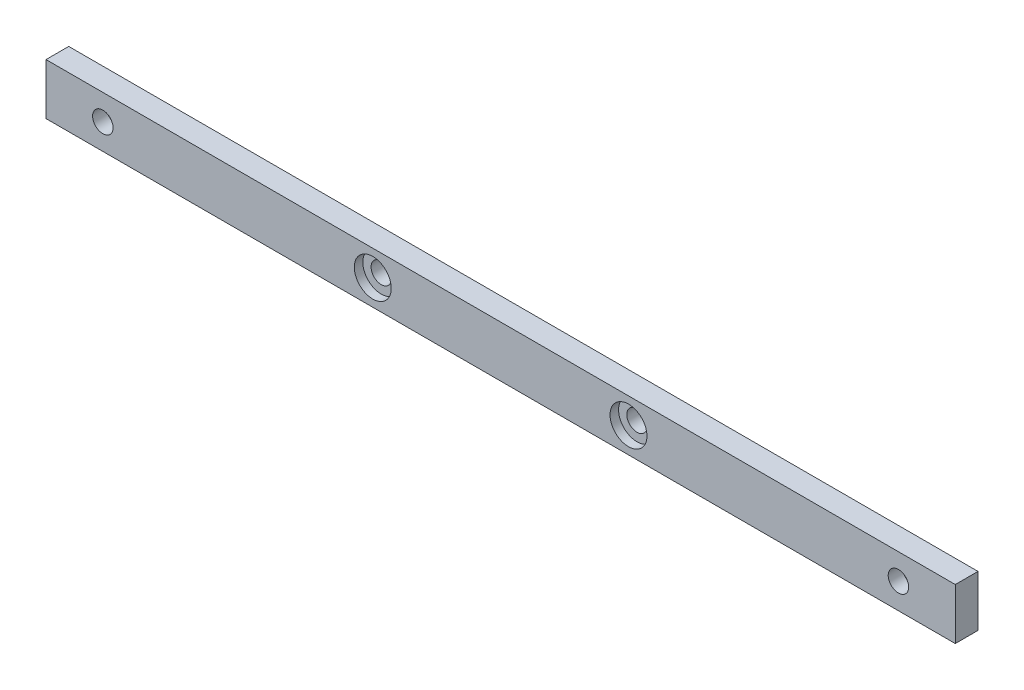
ISO-10303-21;
HEADER;
FILE_DESCRIPTION(('STEP AP214'),'2;1');
FILE_NAME('part.step','',(''),(''),'','','');
FILE_SCHEMA(('AUTOMOTIVE_DESIGN { 1 0 10303 214 1 1 1 1 }'));
ENDSEC;
DATA;
#1=APPLICATION_CONTEXT('core data for automotive mechanical design processes');
#2=APPLICATION_PROTOCOL_DEFINITION('international standard','automotive_design',2000,#1);
#3=PRODUCT_CONTEXT('',#1,'mechanical');
#4=PRODUCT('Part','Part','',(#3));
#5=PRODUCT_RELATED_PRODUCT_CATEGORY('part','',(#4));
#6=PRODUCT_DEFINITION_FORMATION('','',#4);
#7=PRODUCT_DEFINITION_CONTEXT('part definition',#1,'design');
#8=PRODUCT_DEFINITION('design','',#6,#7);
#9=PRODUCT_DEFINITION_SHAPE('','',#8);
#10=(LENGTH_UNIT() NAMED_UNIT(*) SI_UNIT(.MILLI.,.METRE.));
#11=(NAMED_UNIT(*) PLANE_ANGLE_UNIT() SI_UNIT($,.RADIAN.));
#12=(NAMED_UNIT(*) SI_UNIT($,.STERADIAN.) SOLID_ANGLE_UNIT());
#13=UNCERTAINTY_MEASURE_WITH_UNIT(LENGTH_MEASURE(1.E-05),#10,'distance_accuracy_value','');
#14=(GEOMETRIC_REPRESENTATION_CONTEXT(3) GLOBAL_UNCERTAINTY_ASSIGNED_CONTEXT((#13)) GLOBAL_UNIT_ASSIGNED_CONTEXT((#10,
#11,#12)) REPRESENTATION_CONTEXT('',''));
#15=CARTESIAN_POINT('',(0.,0.,0.));
#16=DIRECTION('',(0.,0.,1.));
#17=DIRECTION('',(1.,0.,0.));
#18=AXIS2_PLACEMENT_3D('',#15,#16,#17);
#19=CARTESIAN_POINT('',(52.5,14.5,-0.00100000000000013));
#20=DIRECTION('',(0.,0.,1.));
#21=DIRECTION('',(1.,0.,0.));
#22=AXIS2_PLACEMENT_3D('',#19,#20,#21);
#23=CYLINDRICAL_SURFACE('',#22,1.8);
#24=CARTESIAN_POINT('',(52.5,14.5,0.));
#25=DIRECTION('',(0.,0.,-1.));
#26=DIRECTION('',(-1.,0.,0.));
#27=AXIS2_PLACEMENT_3D('',#24,#25,#26);
#28=CIRCLE('',#27,1.8);
#29=CARTESIAN_POINT('',(50.7,14.5,0.));
#30=VERTEX_POINT('',#29);
#31=EDGE_CURVE('E120',#30,#30,#28,.F.);
#32=ORIENTED_EDGE('',*,*,#31,.F.);
#33=EDGE_LOOP('',(#32));
#34=FACE_BOUND('',#33,.T.);
#35=CARTESIAN_POINT('',(52.5,14.5,2.5));
#36=DIRECTION('',(0.,0.,1.));
#37=DIRECTION('',(1.,0.,0.));
#38=AXIS2_PLACEMENT_3D('',#35,#36,#37);
#39=CIRCLE('',#38,1.8);
#40=CARTESIAN_POINT('',(54.3,14.5,2.5));
#41=VERTEX_POINT('',#40);
#42=EDGE_CURVE('E39',#41,#41,#39,.F.);
#43=ORIENTED_EDGE('',*,*,#42,.F.);
#44=EDGE_LOOP('',(#43));
#45=FACE_BOUND('',#44,.T.);
#46=ADVANCED_FACE('F35',(#34,#45),#23,.F.);
#47=CARTESIAN_POINT('',(7.5,14.5,-0.00100000000000013));
#48=DIRECTION('',(0.,0.,1.));
#49=DIRECTION('',(1.,0.,0.));
#50=AXIS2_PLACEMENT_3D('',#47,#48,#49);
#51=CYLINDRICAL_SURFACE('',#50,1.8);
#52=CARTESIAN_POINT('',(7.5,14.5,0.));
#53=DIRECTION('',(0.,0.,-1.));
#54=DIRECTION('',(-1.,0.,0.));
#55=AXIS2_PLACEMENT_3D('',#52,#53,#54);
#56=CIRCLE('',#55,1.8);
#57=CARTESIAN_POINT('',(5.7,14.5,0.));
#58=VERTEX_POINT('',#57);
#59=EDGE_CURVE('E135',#58,#58,#56,.F.);
#60=ORIENTED_EDGE('',*,*,#59,.F.);
#61=EDGE_LOOP('',(#60));
#62=FACE_BOUND('',#61,.T.);
#63=CARTESIAN_POINT('',(7.5,14.5,2.5));
#64=DIRECTION('',(0.,0.,1.));
#65=DIRECTION('',(1.,0.,0.));
#66=AXIS2_PLACEMENT_3D('',#63,#64,#65);
#67=CIRCLE('',#66,1.8);
#68=CARTESIAN_POINT('',(9.3,14.5,2.5));
#69=VERTEX_POINT('',#68);
#70=EDGE_CURVE('E114',#69,#69,#67,.F.);
#71=ORIENTED_EDGE('',*,*,#70,.F.);
#72=EDGE_LOOP('',(#71));
#73=FACE_BOUND('',#72,.T.);
#74=ADVANCED_FACE('F178',(#62,#73),#51,.F.);
#75=CARTESIAN_POINT('',(-40.,14.5,-5.09116882454315));
#76=DIRECTION('',(0.,0.,1.));
#77=DIRECTION('',(1.,0.,0.));
#78=AXIS2_PLACEMENT_3D('',#75,#76,#77);
#79=CYLINDRICAL_SURFACE('',#78,1.8);
#80=CARTESIAN_POINT('',(-40.,14.5,4.));
#81=DIRECTION('',(0.,0.,1.));
#82=DIRECTION('',(1.,0.,0.));
#83=AXIS2_PLACEMENT_3D('',#80,#81,#82);
#84=CIRCLE('',#83,1.8);
#85=CARTESIAN_POINT('',(-38.2,14.5,4.));
#86=VERTEX_POINT('',#85);
#87=EDGE_CURVE('E113',#86,#86,#84,.T.);
#88=ORIENTED_EDGE('',*,*,#87,.T.);
#89=EDGE_LOOP('',(#88));
#90=FACE_BOUND('',#89,.T.);
#91=CARTESIAN_POINT('',(-40.,14.5,1.5));
#92=DIRECTION('',(0.,0.,-1.));
#93=DIRECTION('',(-1.,0.,0.));
#94=AXIS2_PLACEMENT_3D('',#91,#92,#93);
#95=CIRCLE('',#94,1.8);
#96=CARTESIAN_POINT('',(-41.8,14.5,1.5));
#97=VERTEX_POINT('',#96);
#98=EDGE_CURVE('E110',#97,#97,#95,.F.);
#99=ORIENTED_EDGE('',*,*,#98,.F.);
#100=EDGE_LOOP('',(#99));
#101=FACE_BOUND('',#100,.T.);
#102=ADVANCED_FACE('F184',(#90,#101),#79,.F.);
#103=CARTESIAN_POINT('',(100.,14.5,-5.09116882454315));
#104=DIRECTION('',(0.,0.,1.));
#105=DIRECTION('',(1.,0.,0.));
#106=AXIS2_PLACEMENT_3D('',#103,#104,#105);
#107=CYLINDRICAL_SURFACE('',#106,1.79999999999999);
#108=CARTESIAN_POINT('',(100.,14.5,4.));
#109=DIRECTION('',(0.,0.,1.));
#110=DIRECTION('',(1.,0.,0.));
#111=AXIS2_PLACEMENT_3D('',#108,#109,#110);
#112=CIRCLE('',#111,1.79999999999999);
#113=CARTESIAN_POINT('',(101.8,14.5,4.));
#114=VERTEX_POINT('',#113);
#115=EDGE_CURVE('E106',#114,#114,#112,.T.);
#116=ORIENTED_EDGE('',*,*,#115,.T.);
#117=EDGE_LOOP('',(#116));
#118=FACE_BOUND('',#117,.T.);
#119=CARTESIAN_POINT('',(100.,14.5,1.5));
#120=DIRECTION('',(0.,0.,-1.));
#121=DIRECTION('',(-1.,0.,0.));
#122=AXIS2_PLACEMENT_3D('',#119,#120,#121);
#123=CIRCLE('',#122,1.79999999999999);
#124=CARTESIAN_POINT('',(98.2,14.5,1.5));
#125=VERTEX_POINT('',#124);
#126=EDGE_CURVE('E107',#125,#125,#123,.F.);
#127=ORIENTED_EDGE('',*,*,#126,.F.);
#128=EDGE_LOOP('',(#127));
#129=FACE_BOUND('',#128,.T.);
#130=ADVANCED_FACE('F203',(#118,#129),#107,.F.);
#131=CARTESIAN_POINT('',(0.,0.,4.));
#132=DIRECTION('',(0.,0.,-1.));
#133=DIRECTION('',(-1.,0.,0.));
#134=AXIS2_PLACEMENT_3D('',#131,#132,#133);
#135=PLANE('',#134);
#136=CARTESIAN_POINT('',(7.5,14.5,4.));
#137=DIRECTION('',(0.,0.,1.));
#138=DIRECTION('',(1.,0.,0.));
#139=AXIS2_PLACEMENT_3D('',#136,#137,#138);
#140=CIRCLE('',#139,3.25);
#141=CARTESIAN_POINT('',(10.75,14.5,4.));
#142=VERTEX_POINT('',#141);
#143=EDGE_CURVE('E122',#142,#142,#140,.T.);
#144=ORIENTED_EDGE('',*,*,#143,.F.);
#145=EDGE_LOOP('',(#144));
#146=FACE_BOUND('',#145,.T.);
#147=CARTESIAN_POINT('',(52.5,14.5,4.));
#148=DIRECTION('',(0.,0.,1.));
#149=DIRECTION('',(1.,0.,0.));
#150=AXIS2_PLACEMENT_3D('',#147,#148,#149);
#151=CIRCLE('',#150,3.25);
#152=CARTESIAN_POINT('',(55.75,14.5,4.));
#153=VERTEX_POINT('',#152);
#154=EDGE_CURVE('E132',#153,#153,#151,.T.);
#155=ORIENTED_EDGE('',*,*,#154,.F.);
#156=EDGE_LOOP('',(#155));
#157=FACE_BOUND('',#156,.T.);
#158=ORIENTED_EDGE('',*,*,#115,.F.);
#159=EDGE_LOOP('',(#158));
#160=FACE_BOUND('',#159,.T.);
#161=ORIENTED_EDGE('',*,*,#87,.F.);
#162=EDGE_LOOP('',(#161));
#163=FACE_BOUND('',#162,.T.);
#164=DIRECTION('',(1.,0.,0.));
#165=VECTOR('',#164,1.);
#166=CARTESIAN_POINT('',(-50.,10.,4.));
#167=LINE('',#166,#165);
#168=CARTESIAN_POINT('',(-50.,10.,4.));
#169=VERTEX_POINT('',#168);
#170=CARTESIAN_POINT('',(110.,10.,4.));
#171=VERTEX_POINT('',#170);
#172=EDGE_CURVE('E98',#169,#171,#167,.T.);
#173=ORIENTED_EDGE('',*,*,#172,.T.);
#174=DIRECTION('',(0.,-1.,0.));
#175=VECTOR('',#174,1.);
#176=CARTESIAN_POINT('',(110.,19.,4.));
#177=LINE('',#176,#175);
#178=CARTESIAN_POINT('',(110.,19.,4.));
#179=VERTEX_POINT('',#178);
#180=EDGE_CURVE('E89',#179,#171,#177,.T.);
#181=ORIENTED_EDGE('',*,*,#180,.F.);
#182=DIRECTION('',(1.,0.,0.));
#183=VECTOR('',#182,1.);
#184=CARTESIAN_POINT('',(-50.,19.,4.));
#185=LINE('',#184,#183);
#186=CARTESIAN_POINT('',(-50.,19.,4.));
#187=VERTEX_POINT('',#186);
#188=EDGE_CURVE('E101',#187,#179,#185,.T.);
#189=ORIENTED_EDGE('',*,*,#188,.F.);
#190=DIRECTION('',(0.,1.,0.));
#191=VECTOR('',#190,1.);
#192=CARTESIAN_POINT('',(-50.,10.,4.));
#193=LINE('',#192,#191);
#194=EDGE_CURVE('E104',#169,#187,#193,.T.);
#195=ORIENTED_EDGE('',*,*,#194,.F.);
#196=EDGE_LOOP('',(#173,#181,#189,#195));
#197=FACE_BOUND('',#196,.T.);
#198=ADVANCED_FACE('F162',(#146,#157,#160,#163,#197),#135,.F.);
#199=CARTESIAN_POINT('',(0.,0.,0.));
#200=DIRECTION('',(0.,0.,-1.));
#201=DIRECTION('',(-1.,0.,0.));
#202=AXIS2_PLACEMENT_3D('',#199,#200,#201);
#203=PLANE('',#202);
#204=DIRECTION('',(0.,-1.,0.));
#205=VECTOR('',#204,1.);
#206=CARTESIAN_POINT('',(110.,19.,0.));
#207=LINE('',#206,#205);
#208=CARTESIAN_POINT('',(110.,19.,0.));
#209=VERTEX_POINT('',#208);
#210=CARTESIAN_POINT('',(110.,10.,0.));
#211=VERTEX_POINT('',#210);
#212=EDGE_CURVE('E11',#209,#211,#207,.T.);
#213=ORIENTED_EDGE('',*,*,#212,.T.);
#214=DIRECTION('',(1.,0.,0.));
#215=VECTOR('',#214,1.);
#216=CARTESIAN_POINT('',(-50.,10.,0.));
#217=LINE('',#216,#215);
#218=CARTESIAN_POINT('',(-50.,10.,0.));
#219=VERTEX_POINT('',#218);
#220=EDGE_CURVE('E83',#219,#211,#217,.T.);
#221=ORIENTED_EDGE('',*,*,#220,.F.);
#222=DIRECTION('',(0.,1.,0.));
#223=VECTOR('',#222,1.);
#224=CARTESIAN_POINT('',(-50.,10.,0.));
#225=LINE('',#224,#223);
#226=CARTESIAN_POINT('',(-50.,19.,0.));
#227=VERTEX_POINT('',#226);
#228=EDGE_CURVE('E95',#219,#227,#225,.T.);
#229=ORIENTED_EDGE('',*,*,#228,.T.);
#230=DIRECTION('',(1.,0.,0.));
#231=VECTOR('',#230,1.);
#232=CARTESIAN_POINT('',(-50.,19.,0.));
#233=LINE('',#232,#231);
#234=EDGE_CURVE('E44',#227,#209,#233,.T.);
#235=ORIENTED_EDGE('',*,*,#234,.T.);
#236=EDGE_LOOP('',(#213,#221,#229,#235));
#237=FACE_BOUND('',#236,.T.);
#238=ORIENTED_EDGE('',*,*,#59,.T.);
#239=EDGE_LOOP('',(#238));
#240=FACE_BOUND('',#239,.T.);
#241=ORIENTED_EDGE('',*,*,#31,.T.);
#242=EDGE_LOOP('',(#241));
#243=FACE_BOUND('',#242,.T.);
#244=CARTESIAN_POINT('',(100.,14.5,0.));
#245=DIRECTION('',(0.,0.,-1.));
#246=DIRECTION('',(-1.,0.,0.));
#247=AXIS2_PLACEMENT_3D('',#244,#245,#246);
#248=CIRCLE('',#247,3.25000000000001);
#249=CARTESIAN_POINT('',(96.75,14.5,0.));
#250=VERTEX_POINT('',#249);
#251=EDGE_CURVE('E143',#250,#250,#248,.T.);
#252=ORIENTED_EDGE('',*,*,#251,.F.);
#253=EDGE_LOOP('',(#252));
#254=FACE_BOUND('',#253,.T.);
#255=CARTESIAN_POINT('',(-40.,14.5,0.));
#256=DIRECTION('',(0.,0.,-1.));
#257=DIRECTION('',(-1.,0.,0.));
#258=AXIS2_PLACEMENT_3D('',#255,#256,#257);
#259=CIRCLE('',#258,3.25);
#260=CARTESIAN_POINT('',(-43.25,14.5,0.));
#261=VERTEX_POINT('',#260);
#262=EDGE_CURVE('E138',#261,#261,#259,.T.);
#263=ORIENTED_EDGE('',*,*,#262,.F.);
#264=EDGE_LOOP('',(#263));
#265=FACE_BOUND('',#264,.T.);
#266=ADVANCED_FACE('F37',(#237,#240,#243,#254,#265),#203,.T.);
#267=CARTESIAN_POINT('',(-50.,10.,-160.252925090308));
#268=DIRECTION('',(0.,-1.,0.));
#269=DIRECTION('',(0.,0.,-1.));
#270=AXIS2_PLACEMENT_3D('',#267,#268,#269);
#271=PLANE('',#270);
#272=ORIENTED_EDGE('',*,*,#220,.T.);
#273=DIRECTION('',(0.,0.,1.));
#274=VECTOR('',#273,1.);
#275=CARTESIAN_POINT('',(110.,10.,-160.252925090308));
#276=LINE('',#275,#274);
#277=EDGE_CURVE('E86',#211,#171,#276,.T.);
#278=ORIENTED_EDGE('',*,*,#277,.T.);
#279=ORIENTED_EDGE('',*,*,#172,.F.);
#280=DIRECTION('',(0.,0.,1.));
#281=VECTOR('',#280,1.);
#282=CARTESIAN_POINT('',(-50.,10.,-160.252925090308));
#283=LINE('',#282,#281);
#284=EDGE_CURVE('E58',#219,#169,#283,.T.);
#285=ORIENTED_EDGE('',*,*,#284,.F.);
#286=EDGE_LOOP('',(#272,#278,#279,#285));
#287=FACE_BOUND('',#286,.T.);
#288=ADVANCED_FACE('F84',(#287),#271,.T.);
#289=CARTESIAN_POINT('',(-50.,19.,-160.252925090308));
#290=DIRECTION('',(0.,-1.,0.));
#291=DIRECTION('',(0.,0.,-1.));
#292=AXIS2_PLACEMENT_3D('',#289,#290,#291);
#293=PLANE('',#292);
#294=ORIENTED_EDGE('',*,*,#234,.F.);
#295=DIRECTION('',(0.,0.,1.));
#296=VECTOR('',#295,1.);
#297=CARTESIAN_POINT('',(-50.,19.,-160.252925090308));
#298=LINE('',#297,#296);
#299=EDGE_CURVE('E52',#227,#187,#298,.T.);
#300=ORIENTED_EDGE('',*,*,#299,.T.);
#301=ORIENTED_EDGE('',*,*,#188,.T.);
#302=DIRECTION('',(0.,0.,1.));
#303=VECTOR('',#302,1.);
#304=CARTESIAN_POINT('',(110.,19.,-160.252925090308));
#305=LINE('',#304,#303);
#306=EDGE_CURVE('E74',#209,#179,#305,.T.);
#307=ORIENTED_EDGE('',*,*,#306,.F.);
#308=EDGE_LOOP('',(#294,#300,#301,#307));
#309=FACE_BOUND('',#308,.T.);
#310=ADVANCED_FACE('F160',(#309),#293,.F.);
#311=CARTESIAN_POINT('',(110.,19.,-160.252925090308));
#312=DIRECTION('',(-1.,0.,0.));
#313=DIRECTION('',(0.,0.,1.));
#314=AXIS2_PLACEMENT_3D('',#311,#312,#313);
#315=PLANE('',#314);
#316=ORIENTED_EDGE('',*,*,#212,.F.);
#317=ORIENTED_EDGE('',*,*,#306,.T.);
#318=ORIENTED_EDGE('',*,*,#180,.T.);
#319=ORIENTED_EDGE('',*,*,#277,.F.);
#320=EDGE_LOOP('',(#316,#317,#318,#319));
#321=FACE_BOUND('',#320,.T.);
#322=ADVANCED_FACE('F91',(#321),#315,.F.);
#323=CARTESIAN_POINT('',(-50.,10.,-160.252925090308));
#324=DIRECTION('',(1.,0.,0.));
#325=DIRECTION('',(0.,0.,-1.));
#326=AXIS2_PLACEMENT_3D('',#323,#324,#325);
#327=PLANE('',#326);
#328=ORIENTED_EDGE('',*,*,#228,.F.);
#329=ORIENTED_EDGE('',*,*,#284,.T.);
#330=ORIENTED_EDGE('',*,*,#194,.T.);
#331=ORIENTED_EDGE('',*,*,#299,.F.);
#332=EDGE_LOOP('',(#328,#329,#330,#331));
#333=FACE_BOUND('',#332,.T.);
#334=ADVANCED_FACE('F163',(#333),#327,.F.);
#335=CARTESIAN_POINT('',(100.,14.5,1.5));
#336=DIRECTION('',(0.,0.,-1.));
#337=DIRECTION('',(-1.,0.,0.));
#338=AXIS2_PLACEMENT_3D('',#335,#336,#337);
#339=PLANE('',#338);
#340=CARTESIAN_POINT('',(100.,14.5,1.5));
#341=DIRECTION('',(0.,0.,-1.));
#342=DIRECTION('',(-1.,0.,0.));
#343=AXIS2_PLACEMENT_3D('',#340,#341,#342);
#344=CIRCLE('',#343,3.25000000000001);
#345=CARTESIAN_POINT('',(96.75,14.5,1.5));
#346=VERTEX_POINT('',#345);
#347=EDGE_CURVE('E111',#346,#346,#344,.T.);
#348=ORIENTED_EDGE('',*,*,#347,.T.);
#349=EDGE_LOOP('',(#348));
#350=FACE_BOUND('',#349,.T.);
#351=ORIENTED_EDGE('',*,*,#126,.T.);
#352=EDGE_LOOP('',(#351));
#353=FACE_BOUND('',#352,.T.);
#354=ADVANCED_FACE('F165',(#350,#353),#339,.T.);
#355=CARTESIAN_POINT('',(100.,14.5,1.5));
#356=DIRECTION('',(0.,0.,-1.));
#357=DIRECTION('',(-1.,0.,0.));
#358=AXIS2_PLACEMENT_3D('',#355,#356,#357);
#359=CYLINDRICAL_SURFACE('',#358,3.25000000000001);
#360=ORIENTED_EDGE('',*,*,#347,.F.);
#361=EDGE_LOOP('',(#360));
#362=FACE_BOUND('',#361,.T.);
#363=ORIENTED_EDGE('',*,*,#251,.T.);
#364=EDGE_LOOP('',(#363));
#365=FACE_BOUND('',#364,.T.);
#366=ADVANCED_FACE('F171',(#362,#365),#359,.F.);
#367=CARTESIAN_POINT('',(-40.,14.5,1.5));
#368=DIRECTION('',(0.,0.,-1.));
#369=DIRECTION('',(-1.,0.,0.));
#370=AXIS2_PLACEMENT_3D('',#367,#368,#369);
#371=PLANE('',#370);
#372=CARTESIAN_POINT('',(-40.,14.5,1.5));
#373=DIRECTION('',(0.,0.,-1.));
#374=DIRECTION('',(-1.,0.,0.));
#375=AXIS2_PLACEMENT_3D('',#372,#373,#374);
#376=CIRCLE('',#375,3.25);
#377=CARTESIAN_POINT('',(-43.25,14.5,1.5));
#378=VERTEX_POINT('',#377);
#379=EDGE_CURVE('E146',#378,#378,#376,.T.);
#380=ORIENTED_EDGE('',*,*,#379,.T.);
#381=EDGE_LOOP('',(#380));
#382=FACE_BOUND('',#381,.T.);
#383=ORIENTED_EDGE('',*,*,#98,.T.);
#384=EDGE_LOOP('',(#383));
#385=FACE_BOUND('',#384,.T.);
#386=ADVANCED_FACE('F193',(#382,#385),#371,.T.);
#387=CARTESIAN_POINT('',(-40.,14.5,1.5));
#388=DIRECTION('',(0.,0.,-1.));
#389=DIRECTION('',(-1.,0.,0.));
#390=AXIS2_PLACEMENT_3D('',#387,#388,#389);
#391=CYLINDRICAL_SURFACE('',#390,3.25);
#392=ORIENTED_EDGE('',*,*,#379,.F.);
#393=EDGE_LOOP('',(#392));
#394=FACE_BOUND('',#393,.T.);
#395=ORIENTED_EDGE('',*,*,#262,.T.);
#396=EDGE_LOOP('',(#395));
#397=FACE_BOUND('',#396,.T.);
#398=ADVANCED_FACE('F197',(#394,#397),#391,.F.);
#399=CARTESIAN_POINT('',(7.5,14.5,2.5));
#400=DIRECTION('',(0.,0.,1.));
#401=DIRECTION('',(1.,0.,0.));
#402=AXIS2_PLACEMENT_3D('',#399,#400,#401);
#403=PLANE('',#402);
#404=CARTESIAN_POINT('',(7.5,14.5,2.5));
#405=DIRECTION('',(0.,0.,1.));
#406=DIRECTION('',(1.,0.,0.));
#407=AXIS2_PLACEMENT_3D('',#404,#405,#406);
#408=CIRCLE('',#407,3.25);
#409=CARTESIAN_POINT('',(10.75,14.5,2.5));
#410=VERTEX_POINT('',#409);
#411=EDGE_CURVE('E116',#410,#410,#408,.T.);
#412=ORIENTED_EDGE('',*,*,#411,.T.);
#413=EDGE_LOOP('',(#412));
#414=FACE_BOUND('',#413,.T.);
#415=ORIENTED_EDGE('',*,*,#70,.T.);
#416=EDGE_LOOP('',(#415));
#417=FACE_BOUND('',#416,.T.);
#418=ADVANCED_FACE('F201',(#414,#417),#403,.T.);
#419=CARTESIAN_POINT('',(7.5,14.5,2.5));
#420=DIRECTION('',(0.,0.,1.));
#421=DIRECTION('',(1.,0.,0.));
#422=AXIS2_PLACEMENT_3D('',#419,#420,#421);
#423=CYLINDRICAL_SURFACE('',#422,3.25);
#424=ORIENTED_EDGE('',*,*,#411,.F.);
#425=EDGE_LOOP('',(#424));
#426=FACE_BOUND('',#425,.T.);
#427=ORIENTED_EDGE('',*,*,#143,.T.);
#428=EDGE_LOOP('',(#427));
#429=FACE_BOUND('',#428,.T.);
#430=ADVANCED_FACE('F312',(#426,#429),#423,.F.);
#431=CARTESIAN_POINT('',(52.5,14.5,2.5));
#432=DIRECTION('',(0.,0.,1.));
#433=DIRECTION('',(1.,0.,0.));
#434=AXIS2_PLACEMENT_3D('',#431,#432,#433);
#435=PLANE('',#434);
#436=CARTESIAN_POINT('',(52.5,14.5,2.5));
#437=DIRECTION('',(0.,0.,1.));
#438=DIRECTION('',(1.,0.,0.));
#439=AXIS2_PLACEMENT_3D('',#436,#437,#438);
#440=CIRCLE('',#439,3.25);
#441=CARTESIAN_POINT('',(55.75,14.5,2.5));
#442=VERTEX_POINT('',#441);
#443=EDGE_CURVE('E127',#442,#442,#440,.T.);
#444=ORIENTED_EDGE('',*,*,#443,.T.);
#445=EDGE_LOOP('',(#444));
#446=FACE_BOUND('',#445,.T.);
#447=ORIENTED_EDGE('',*,*,#42,.T.);
#448=EDGE_LOOP('',(#447));
#449=FACE_BOUND('',#448,.T.);
#450=ADVANCED_FACE('F320',(#446,#449),#435,.T.);
#451=CARTESIAN_POINT('',(52.5,14.5,2.5));
#452=DIRECTION('',(0.,0.,1.));
#453=DIRECTION('',(1.,0.,0.));
#454=AXIS2_PLACEMENT_3D('',#451,#452,#453);
#455=CYLINDRICAL_SURFACE('',#454,3.25);
#456=ORIENTED_EDGE('',*,*,#443,.F.);
#457=EDGE_LOOP('',(#456));
#458=FACE_BOUND('',#457,.T.);
#459=ORIENTED_EDGE('',*,*,#154,.T.);
#460=EDGE_LOOP('',(#459));
#461=FACE_BOUND('',#460,.T.);
#462=ADVANCED_FACE('F329',(#458,#461),#455,.F.);
#463=CLOSED_SHELL('',(#46,#74,#102,#130,#198,#266,#288,#310,#322,#334,#354,#366,#386,#398,#418,
#430,#450,#462));
#464=MANIFOLD_SOLID_BREP('B2',#463);
#465=ADVANCED_BREP_SHAPE_REPRESENTATION('',(#18,#464),#14);
#466=SHAPE_DEFINITION_REPRESENTATION(#9,#465);
ENDSEC;
END-ISO-10303-21;
